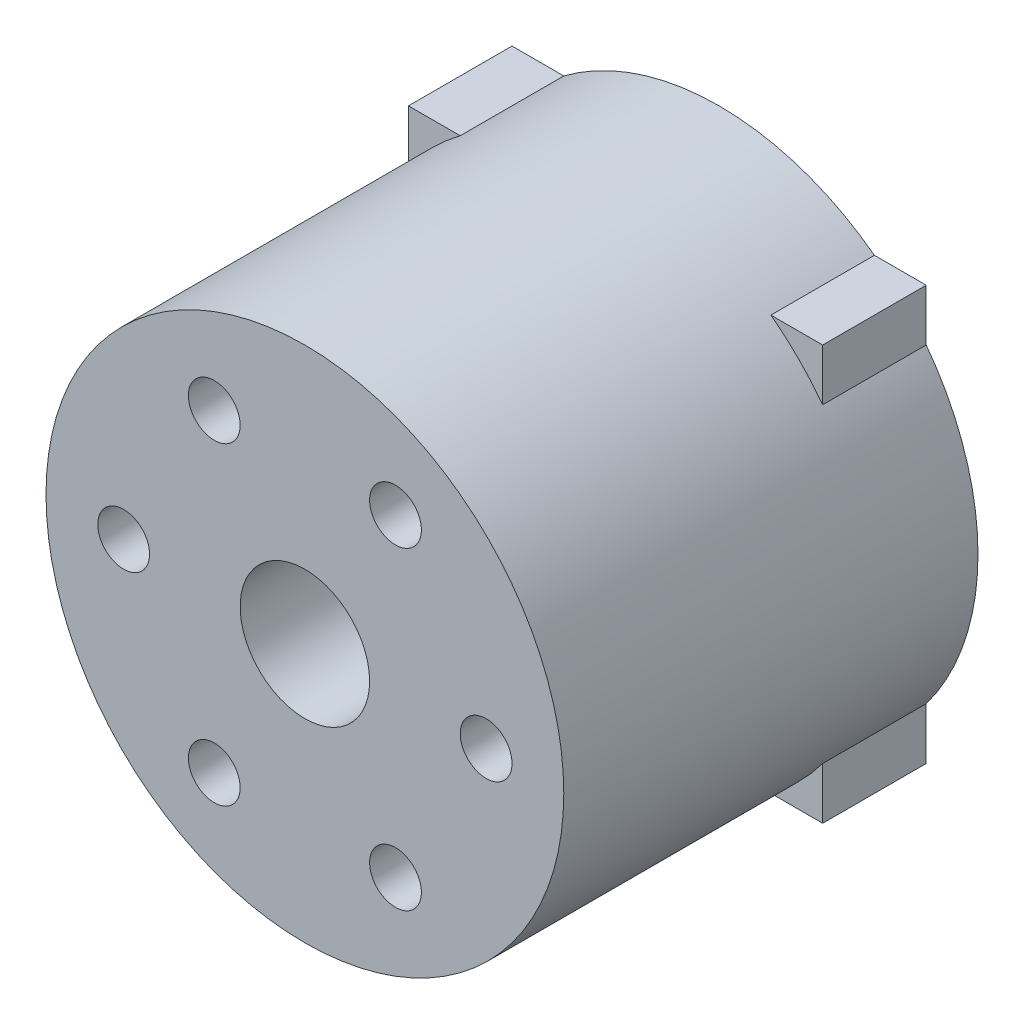
ISO-10303-21;
HEADER;
FILE_DESCRIPTION(('STEP AP214'),'2;1');
FILE_NAME('part.step','',(''),(''),'','','');
FILE_SCHEMA(('AUTOMOTIVE_DESIGN { 1 0 10303 214 1 1 1 1 }'));
ENDSEC;
DATA;
#1=APPLICATION_CONTEXT('core data for automotive mechanical design processes');
#2=APPLICATION_PROTOCOL_DEFINITION('international standard','automotive_design',2000,#1);
#3=PRODUCT_CONTEXT('',#1,'mechanical');
#4=PRODUCT('Part','Part','',(#3));
#5=PRODUCT_RELATED_PRODUCT_CATEGORY('part','',(#4));
#6=PRODUCT_DEFINITION_FORMATION('','',#4);
#7=PRODUCT_DEFINITION_CONTEXT('part definition',#1,'design');
#8=PRODUCT_DEFINITION('design','',#6,#7);
#9=PRODUCT_DEFINITION_SHAPE('','',#8);
#10=(LENGTH_UNIT() NAMED_UNIT(*) SI_UNIT(.MILLI.,.METRE.));
#11=(NAMED_UNIT(*) PLANE_ANGLE_UNIT() SI_UNIT($,.RADIAN.));
#12=(NAMED_UNIT(*) SI_UNIT($,.STERADIAN.) SOLID_ANGLE_UNIT());
#13=UNCERTAINTY_MEASURE_WITH_UNIT(LENGTH_MEASURE(1.E-05),#10,'distance_accuracy_value','');
#14=(GEOMETRIC_REPRESENTATION_CONTEXT(3) GLOBAL_UNCERTAINTY_ASSIGNED_CONTEXT((#13)) GLOBAL_UNIT_ASSIGNED_CONTEXT((#10,
#11,#12)) REPRESENTATION_CONTEXT('',''));
#15=CARTESIAN_POINT('',(0.,0.,0.));
#16=DIRECTION('',(0.,0.,1.));
#17=DIRECTION('',(1.,0.,0.));
#18=AXIS2_PLACEMENT_3D('',#15,#16,#17);
#19=CARTESIAN_POINT('',(0.,0.,20.));
#20=DIRECTION('',(0.,0.,1.));
#21=DIRECTION('',(1.,0.,0.));
#22=AXIS2_PLACEMENT_3D('',#19,#20,#21);
#23=PLANE('',#22);
#24=CARTESIAN_POINT('',(17.5,30.310889132455,20.));
#25=DIRECTION('',(0.,0.,-1.));
#26=DIRECTION('',(0.50000000000019,0.866025403784329,0.));
#27=AXIS2_PLACEMENT_3D('',#24,#25,#26);
#28=CIRCLE('',#27,5.);
#29=CARTESIAN_POINT('',(20.,34.641016151378,20.));
#30=VERTEX_POINT('',#29);
#31=EDGE_CURVE('E10',#30,#30,#28,.T.);
#32=ORIENTED_EDGE('',*,*,#31,.F.);
#33=EDGE_LOOP('',(#32));
#34=FACE_BOUND('',#33,.T.);
#35=ADVANCED_FACE('F16',(#34),#23,.T.);
#36=CARTESIAN_POINT('',(0.,0.,20.));
#37=DIRECTION('',(0.,0.,1.));
#38=DIRECTION('',(1.,0.,0.));
#39=AXIS2_PLACEMENT_3D('',#36,#37,#38);
#40=PLANE('',#39);
#41=CARTESIAN_POINT('',(-17.5,30.310889132455,20.));
#42=DIRECTION('',(0.,0.,-1.));
#43=DIRECTION('',(-0.50000000000019,0.866025403784329,0.));
#44=AXIS2_PLACEMENT_3D('',#41,#42,#43);
#45=CIRCLE('',#44,5.);
#46=CARTESIAN_POINT('',(-20.,34.641016151378,20.));
#47=VERTEX_POINT('',#46);
#48=EDGE_CURVE('E44',#47,#47,#45,.T.);
#49=ORIENTED_EDGE('',*,*,#48,.F.);
#50=EDGE_LOOP('',(#49));
#51=FACE_BOUND('',#50,.T.);
#52=ADVANCED_FACE('F424',(#51),#40,.T.);
#53=CARTESIAN_POINT('',(0.,0.,20.));
#54=DIRECTION('',(0.,0.,1.));
#55=DIRECTION('',(1.,0.,0.));
#56=AXIS2_PLACEMENT_3D('',#53,#54,#55);
#57=PLANE('',#56);
#58=CARTESIAN_POINT('',(-35.,0.,20.));
#59=DIRECTION('',(0.,0.,-1.));
#60=DIRECTION('',(-1.,0.,0.));
#61=AXIS2_PLACEMENT_3D('',#58,#59,#60);
#62=CIRCLE('',#61,5.);
#63=CARTESIAN_POINT('',(-40.,0.,20.));
#64=VERTEX_POINT('',#63);
#65=EDGE_CURVE('E274',#64,#64,#62,.T.);
#66=ORIENTED_EDGE('',*,*,#65,.F.);
#67=EDGE_LOOP('',(#66));
#68=FACE_BOUND('',#67,.T.);
#69=ADVANCED_FACE('F421',(#68),#57,.T.);
#70=CARTESIAN_POINT('',(0.,0.,20.));
#71=DIRECTION('',(0.,0.,1.));
#72=DIRECTION('',(1.,0.,0.));
#73=AXIS2_PLACEMENT_3D('',#70,#71,#72);
#74=PLANE('',#73);
#75=CARTESIAN_POINT('',(35.,0.,20.));
#76=DIRECTION('',(0.,0.,-1.));
#77=DIRECTION('',(1.,0.,0.));
#78=AXIS2_PLACEMENT_3D('',#75,#76,#77);
#79=CIRCLE('',#78,5.);
#80=CARTESIAN_POINT('',(40.,0.,20.));
#81=VERTEX_POINT('',#80);
#82=EDGE_CURVE('E331',#81,#81,#79,.T.);
#83=ORIENTED_EDGE('',*,*,#82,.F.);
#84=EDGE_LOOP('',(#83));
#85=FACE_BOUND('',#84,.T.);
#86=ADVANCED_FACE('F423',(#85),#74,.T.);
#87=CARTESIAN_POINT('',(0.,0.,20.));
#88=DIRECTION('',(0.,0.,1.));
#89=DIRECTION('',(1.,0.,0.));
#90=AXIS2_PLACEMENT_3D('',#87,#88,#89);
#91=PLANE('',#90);
#92=CARTESIAN_POINT('',(17.5,-30.31088913245,20.));
#93=DIRECTION('',(0.,0.,-1.));
#94=DIRECTION('',(0.50000000000019,-0.866025403784329,0.));
#95=AXIS2_PLACEMENT_3D('',#92,#93,#94);
#96=CIRCLE('',#95,5.);
#97=CARTESIAN_POINT('',(20.,-34.64101615137,20.));
#98=VERTEX_POINT('',#97);
#99=EDGE_CURVE('E242',#98,#98,#96,.T.);
#100=ORIENTED_EDGE('',*,*,#99,.F.);
#101=EDGE_LOOP('',(#100));
#102=FACE_BOUND('',#101,.T.);
#103=ADVANCED_FACE('F431',(#102),#91,.T.);
#104=CARTESIAN_POINT('',(0.,0.,20.));
#105=DIRECTION('',(0.,0.,1.));
#106=DIRECTION('',(1.,0.,0.));
#107=AXIS2_PLACEMENT_3D('',#104,#105,#106);
#108=PLANE('',#107);
#109=CARTESIAN_POINT('',(-17.5,-30.31088913245,20.));
#110=DIRECTION('',(0.,0.,-1.));
#111=DIRECTION('',(-0.50000000000019,-0.866025403784329,0.));
#112=AXIS2_PLACEMENT_3D('',#109,#110,#111);
#113=CIRCLE('',#112,5.);
#114=CARTESIAN_POINT('',(-20.,-34.64101615137,20.));
#115=VERTEX_POINT('',#114);
#116=EDGE_CURVE('E243',#115,#115,#113,.T.);
#117=ORIENTED_EDGE('',*,*,#116,.F.);
#118=EDGE_LOOP('',(#117));
#119=FACE_BOUND('',#118,.T.);
#120=ADVANCED_FACE('F631',(#119),#108,.T.);
#121=CARTESIAN_POINT('',(17.5,30.310889132455,40.));
#122=DIRECTION('',(0.,0.,-1.));
#123=DIRECTION('',(0.50000000000019,0.866025403784329,0.));
#124=AXIS2_PLACEMENT_3D('',#121,#122,#123);
#125=CYLINDRICAL_SURFACE('',#124,5.);
#126=CARTESIAN_POINT('',(17.5,30.310889132455,80.));
#127=DIRECTION('',(0.,0.,-1.));
#128=DIRECTION('',(0.50000000000019,0.866025403784329,0.));
#129=AXIS2_PLACEMENT_3D('',#126,#127,#128);
#130=CIRCLE('',#129,5.);
#131=CARTESIAN_POINT('',(20.,34.641016151378,80.));
#132=VERTEX_POINT('',#131);
#133=EDGE_CURVE('E313',#132,#132,#130,.T.);
#134=ORIENTED_EDGE('',*,*,#133,.F.);
#135=DIRECTION('',(0.,0.,-1.));
#136=VECTOR('',#135,1.);
#137=CARTESIAN_POINT('',(20.,34.641016151378,80.));
#138=LINE('',#137,#136);
#139=EDGE_CURVE('E19',#132,#30,#138,.T.);
#140=ORIENTED_EDGE('',*,*,#139,.T.);
#141=ORIENTED_EDGE('',*,*,#31,.T.);
#142=ORIENTED_EDGE('',*,*,#139,.F.);
#143=EDGE_LOOP('',(#134,#140,#141,#142));
#144=FACE_BOUND('',#143,.T.);
#145=ADVANCED_FACE('F440',(#144),#125,.F.);
#146=CARTESIAN_POINT('',(-17.5,30.310889132455,40.));
#147=DIRECTION('',(0.,0.,-1.));
#148=DIRECTION('',(-0.50000000000019,0.866025403784329,0.));
#149=AXIS2_PLACEMENT_3D('',#146,#147,#148);
#150=CYLINDRICAL_SURFACE('',#149,5.);
#151=CARTESIAN_POINT('',(-17.5,30.310889132455,80.));
#152=DIRECTION('',(0.,0.,-1.));
#153=DIRECTION('',(-0.50000000000019,0.866025403784329,0.));
#154=AXIS2_PLACEMENT_3D('',#151,#152,#153);
#155=CIRCLE('',#154,5.);
#156=CARTESIAN_POINT('',(-20.,34.641016151378,80.));
#157=VERTEX_POINT('',#156);
#158=EDGE_CURVE('E397',#157,#157,#155,.T.);
#159=ORIENTED_EDGE('',*,*,#158,.F.);
#160=DIRECTION('',(0.,0.,-1.));
#161=VECTOR('',#160,1.);
#162=CARTESIAN_POINT('',(-20.,34.641016151378,80.));
#163=LINE('',#162,#161);
#164=EDGE_CURVE('E271',#157,#47,#163,.T.);
#165=ORIENTED_EDGE('',*,*,#164,.T.);
#166=ORIENTED_EDGE('',*,*,#48,.T.);
#167=ORIENTED_EDGE('',*,*,#164,.F.);
#168=EDGE_LOOP('',(#159,#165,#166,#167));
#169=FACE_BOUND('',#168,.T.);
#170=ADVANCED_FACE('F616',(#169),#150,.F.);
#171=CARTESIAN_POINT('',(-35.,0.,40.));
#172=DIRECTION('',(0.,0.,-1.));
#173=DIRECTION('',(-1.,0.,0.));
#174=AXIS2_PLACEMENT_3D('',#171,#172,#173);
#175=CYLINDRICAL_SURFACE('',#174,5.);
#176=CARTESIAN_POINT('',(-35.,0.,80.));
#177=DIRECTION('',(0.,0.,-1.));
#178=DIRECTION('',(-1.,0.,0.));
#179=AXIS2_PLACEMENT_3D('',#176,#177,#178);
#180=CIRCLE('',#179,5.);
#181=CARTESIAN_POINT('',(-40.,0.,80.));
#182=VERTEX_POINT('',#181);
#183=EDGE_CURVE('E374',#182,#182,#180,.T.);
#184=ORIENTED_EDGE('',*,*,#183,.F.);
#185=DIRECTION('',(0.,0.,-1.));
#186=VECTOR('',#185,1.);
#187=CARTESIAN_POINT('',(-40.,0.,80.));
#188=LINE('',#187,#186);
#189=EDGE_CURVE('E328',#182,#64,#188,.T.);
#190=ORIENTED_EDGE('',*,*,#189,.T.);
#191=ORIENTED_EDGE('',*,*,#65,.T.);
#192=ORIENTED_EDGE('',*,*,#189,.F.);
#193=EDGE_LOOP('',(#184,#190,#191,#192));
#194=FACE_BOUND('',#193,.T.);
#195=ADVANCED_FACE('F419',(#194),#175,.F.);
#196=CARTESIAN_POINT('',(35.,0.,40.));
#197=DIRECTION('',(0.,0.,-1.));
#198=DIRECTION('',(1.,0.,0.));
#199=AXIS2_PLACEMENT_3D('',#196,#197,#198);
#200=CYLINDRICAL_SURFACE('',#199,5.);
#201=CARTESIAN_POINT('',(35.,0.,80.));
#202=DIRECTION('',(0.,0.,-1.));
#203=DIRECTION('',(1.,0.,0.));
#204=AXIS2_PLACEMENT_3D('',#201,#202,#203);
#205=CIRCLE('',#204,5.);
#206=CARTESIAN_POINT('',(40.,0.,80.));
#207=VERTEX_POINT('',#206);
#208=EDGE_CURVE('E370',#207,#207,#205,.T.);
#209=ORIENTED_EDGE('',*,*,#208,.F.);
#210=DIRECTION('',(0.,0.,-1.));
#211=VECTOR('',#210,1.);
#212=CARTESIAN_POINT('',(40.,0.,80.));
#213=LINE('',#212,#211);
#214=EDGE_CURVE('E408',#207,#81,#213,.T.);
#215=ORIENTED_EDGE('',*,*,#214,.T.);
#216=ORIENTED_EDGE('',*,*,#82,.T.);
#217=ORIENTED_EDGE('',*,*,#214,.F.);
#218=EDGE_LOOP('',(#209,#215,#216,#217));
#219=FACE_BOUND('',#218,.T.);
#220=ADVANCED_FACE('F451',(#219),#200,.F.);
#221=CARTESIAN_POINT('',(17.5,-30.31088913245,40.));
#222=DIRECTION('',(0.,0.,-1.));
#223=DIRECTION('',(0.50000000000019,-0.866025403784329,0.));
#224=AXIS2_PLACEMENT_3D('',#221,#222,#223);
#225=CYLINDRICAL_SURFACE('',#224,5.);
#226=CARTESIAN_POINT('',(17.5,-30.31088913245,80.));
#227=DIRECTION('',(0.,0.,-1.));
#228=DIRECTION('',(0.50000000000019,-0.866025403784329,0.));
#229=AXIS2_PLACEMENT_3D('',#226,#227,#228);
#230=CIRCLE('',#229,5.);
#231=CARTESIAN_POINT('',(20.,-34.64101615137,80.));
#232=VERTEX_POINT('',#231);
#233=EDGE_CURVE('E375',#232,#232,#230,.T.);
#234=ORIENTED_EDGE('',*,*,#233,.F.);
#235=DIRECTION('',(0.,0.,-1.));
#236=VECTOR('',#235,1.);
#237=CARTESIAN_POINT('',(20.,-34.64101615137,80.));
#238=LINE('',#237,#236);
#239=EDGE_CURVE('E238',#232,#98,#238,.T.);
#240=ORIENTED_EDGE('',*,*,#239,.T.);
#241=ORIENTED_EDGE('',*,*,#99,.T.);
#242=ORIENTED_EDGE('',*,*,#239,.F.);
#243=EDGE_LOOP('',(#234,#240,#241,#242));
#244=FACE_BOUND('',#243,.T.);
#245=ADVANCED_FACE('F445',(#244),#225,.F.);
#246=CARTESIAN_POINT('',(-17.5,-30.31088913245,40.));
#247=DIRECTION('',(0.,0.,-1.));
#248=DIRECTION('',(-0.50000000000019,-0.866025403784329,0.));
#249=AXIS2_PLACEMENT_3D('',#246,#247,#248);
#250=CYLINDRICAL_SURFACE('',#249,5.);
#251=CARTESIAN_POINT('',(-17.5,-30.31088913245,80.));
#252=DIRECTION('',(0.,0.,-1.));
#253=DIRECTION('',(-0.50000000000019,-0.866025403784329,0.));
#254=AXIS2_PLACEMENT_3D('',#251,#252,#253);
#255=CIRCLE('',#254,5.);
#256=CARTESIAN_POINT('',(-20.,-34.64101615137,80.));
#257=VERTEX_POINT('',#256);
#258=EDGE_CURVE('E381',#257,#257,#255,.T.);
#259=ORIENTED_EDGE('',*,*,#258,.F.);
#260=DIRECTION('',(0.,0.,-1.));
#261=VECTOR('',#260,1.);
#262=CARTESIAN_POINT('',(-20.,-34.64101615137,80.));
#263=LINE('',#262,#261);
#264=EDGE_CURVE('E309',#257,#115,#263,.T.);
#265=ORIENTED_EDGE('',*,*,#264,.T.);
#266=ORIENTED_EDGE('',*,*,#116,.T.);
#267=ORIENTED_EDGE('',*,*,#264,.F.);
#268=EDGE_LOOP('',(#259,#265,#266,#267));
#269=FACE_BOUND('',#268,.T.);
#270=ADVANCED_FACE('F450',(#269),#250,.F.);
#271=CARTESIAN_POINT('',(0.,0.,80.));
#272=DIRECTION('',(0.,0.,1.));
#273=DIRECTION('',(1.,0.,0.));
#274=AXIS2_PLACEMENT_3D('',#271,#272,#273);
#275=PLANE('',#274);
#276=ORIENTED_EDGE('',*,*,#133,.T.);
#277=EDGE_LOOP('',(#276));
#278=FACE_BOUND('',#277,.T.);
#279=ORIENTED_EDGE('',*,*,#158,.T.);
#280=EDGE_LOOP('',(#279));
#281=FACE_BOUND('',#280,.T.);
#282=ORIENTED_EDGE('',*,*,#183,.T.);
#283=EDGE_LOOP('',(#282));
#284=FACE_BOUND('',#283,.T.);
#285=ORIENTED_EDGE('',*,*,#208,.T.);
#286=EDGE_LOOP('',(#285));
#287=FACE_BOUND('',#286,.T.);
#288=CARTESIAN_POINT('',(0.,0.,80.));
#289=DIRECTION('',(0.,0.,-1.));
#290=DIRECTION('',(1.,0.,0.));
#291=AXIS2_PLACEMENT_3D('',#288,#289,#290);
#292=CIRCLE('',#291,12.5);
#293=CARTESIAN_POINT('',(12.5,0.,80.));
#294=VERTEX_POINT('',#293);
#295=EDGE_CURVE('E265',#294,#294,#292,.T.);
#296=ORIENTED_EDGE('',*,*,#295,.T.);
#297=EDGE_LOOP('',(#296));
#298=FACE_BOUND('',#297,.T.);
#299=ORIENTED_EDGE('',*,*,#233,.T.);
#300=EDGE_LOOP('',(#299));
#301=FACE_BOUND('',#300,.T.);
#302=ORIENTED_EDGE('',*,*,#258,.T.);
#303=EDGE_LOOP('',(#302));
#304=FACE_BOUND('',#303,.T.);
#305=CARTESIAN_POINT('',(0.,0.,80.));
#306=DIRECTION('',(0.,0.,1.));
#307=DIRECTION('',(1.,0.,0.));
#308=AXIS2_PLACEMENT_3D('',#305,#306,#307);
#309=CIRCLE('',#308,50.);
#310=CARTESIAN_POINT('',(50.,0.,80.));
#311=VERTEX_POINT('',#310);
#312=EDGE_CURVE('E232',#311,#311,#309,.T.);
#313=ORIENTED_EDGE('',*,*,#312,.T.);
#314=EDGE_LOOP('',(#313));
#315=FACE_BOUND('',#314,.T.);
#316=ADVANCED_FACE('F520',(#278,#281,#284,#287,#298,#301,#304,#315),#275,.T.);
#317=CARTESIAN_POINT('',(0.,0.,0.));
#318=DIRECTION('',(0.,0.,-1.));
#319=DIRECTION('',(1.,0.,0.));
#320=AXIS2_PLACEMENT_3D('',#317,#318,#319);
#321=CYLINDRICAL_SURFACE('',#320,12.5);
#322=CARTESIAN_POINT('',(0.,0.,0.));
#323=DIRECTION('',(0.,0.,1.));
#324=DIRECTION('',(1.,0.,0.));
#325=AXIS2_PLACEMENT_3D('',#322,#323,#324);
#326=CIRCLE('',#325,12.5);
#327=CARTESIAN_POINT('',(12.5,0.,0.));
#328=VERTEX_POINT('',#327);
#329=EDGE_CURVE('E322',#328,#328,#326,.T.);
#330=ORIENTED_EDGE('',*,*,#329,.F.);
#331=DIRECTION('',(0.,0.,1.));
#332=VECTOR('',#331,1.);
#333=CARTESIAN_POINT('',(12.5,0.,0.));
#334=LINE('',#333,#332);
#335=EDGE_CURVE('E261',#328,#294,#334,.T.);
#336=ORIENTED_EDGE('',*,*,#335,.T.);
#337=ORIENTED_EDGE('',*,*,#295,.F.);
#338=ORIENTED_EDGE('',*,*,#335,.F.);
#339=EDGE_LOOP('',(#330,#336,#337,#338));
#340=FACE_BOUND('',#339,.T.);
#341=ADVANCED_FACE('F514',(#340),#321,.F.);
#342=CARTESIAN_POINT('',(40.,-40.,0.));
#343=DIRECTION('',(-1.,0.,0.));
#344=DIRECTION('',(0.,0.,1.));
#345=AXIS2_PLACEMENT_3D('',#342,#343,#344);
#346=PLANE('',#345);
#347=DIRECTION('',(0.,0.,1.));
#348=VECTOR('',#347,1.);
#349=CARTESIAN_POINT('',(40.,40.,0.));
#350=LINE('',#349,#348);
#351=CARTESIAN_POINT('',(40.,40.,0.));
#352=VERTEX_POINT('',#351);
#353=CARTESIAN_POINT('',(40.,40.,20.));
#354=VERTEX_POINT('',#353);
#355=EDGE_CURVE('E275',#352,#354,#350,.T.);
#356=ORIENTED_EDGE('',*,*,#355,.T.);
#357=DIRECTION('',(0.,1.,0.));
#358=VECTOR('',#357,1.);
#359=CARTESIAN_POINT('',(40.,-40.,20.));
#360=LINE('',#359,#358);
#361=CARTESIAN_POINT('',(40.,30.,20.));
#362=VERTEX_POINT('',#361);
#363=EDGE_CURVE('E266',#362,#354,#360,.T.);
#364=ORIENTED_EDGE('',*,*,#363,.F.);
#365=DIRECTION('',(0.,0.,1.));
#366=VECTOR('',#365,1.);
#367=CARTESIAN_POINT('',(40.,30.,0.));
#368=LINE('',#367,#366);
#369=CARTESIAN_POINT('',(40.,29.999999999999,0.));
#370=VERTEX_POINT('',#369);
#371=EDGE_CURVE('E246',#370,#362,#368,.T.);
#372=ORIENTED_EDGE('',*,*,#371,.F.);
#373=DIRECTION('',(0.,1.,0.));
#374=VECTOR('',#373,1.);
#375=CARTESIAN_POINT('',(40.,-40.,0.));
#376=LINE('',#375,#374);
#377=EDGE_CURVE('E318',#370,#352,#376,.T.);
#378=ORIENTED_EDGE('',*,*,#377,.T.);
#379=EDGE_LOOP('',(#356,#364,#372,#378));
#380=FACE_BOUND('',#379,.T.);
#381=ADVANCED_FACE('F519',(#380),#346,.F.);
#382=CARTESIAN_POINT('',(0.,0.,20.));
#383=DIRECTION('',(0.,0.,1.));
#384=DIRECTION('',(1.,0.,0.));
#385=AXIS2_PLACEMENT_3D('',#382,#383,#384);
#386=PLANE('',#385);
#387=CARTESIAN_POINT('',(0.,0.,20.));
#388=DIRECTION('',(0.,0.,1.));
#389=DIRECTION('',(1.,0.,0.));
#390=AXIS2_PLACEMENT_3D('',#387,#388,#389);
#391=CIRCLE('',#390,50.);
#392=CARTESIAN_POINT('',(30.,40.,20.));
#393=VERTEX_POINT('',#392);
#394=EDGE_CURVE('E256',#362,#393,#391,.T.);
#395=ORIENTED_EDGE('',*,*,#394,.F.);
#396=ORIENTED_EDGE('',*,*,#363,.T.);
#397=DIRECTION('',(-1.,0.,0.));
#398=VECTOR('',#397,1.);
#399=CARTESIAN_POINT('',(40.,40.,20.));
#400=LINE('',#399,#398);
#401=EDGE_CURVE('E279',#354,#393,#400,.T.);
#402=ORIENTED_EDGE('',*,*,#401,.T.);
#403=EDGE_LOOP('',(#395,#396,#402));
#404=FACE_BOUND('',#403,.T.);
#405=ADVANCED_FACE('F571',(#404),#386,.T.);
#406=CARTESIAN_POINT('',(40.,40.,0.));
#407=DIRECTION('',(0.,-1.,0.));
#408=DIRECTION('',(0.,0.,-1.));
#409=AXIS2_PLACEMENT_3D('',#406,#407,#408);
#410=PLANE('',#409);
#411=DIRECTION('',(0.,0.,1.));
#412=VECTOR('',#411,1.);
#413=CARTESIAN_POINT('',(30.,40.,0.));
#414=LINE('',#413,#412);
#415=CARTESIAN_POINT('',(30.000000000002,39.999999999999,0.));
#416=VERTEX_POINT('',#415);
#417=EDGE_CURVE('E260',#416,#393,#414,.T.);
#418=ORIENTED_EDGE('',*,*,#417,.T.);
#419=ORIENTED_EDGE('',*,*,#401,.F.);
#420=ORIENTED_EDGE('',*,*,#355,.F.);
#421=DIRECTION('',(-1.,0.,0.));
#422=VECTOR('',#421,1.);
#423=CARTESIAN_POINT('',(40.,40.,0.));
#424=LINE('',#423,#422);
#425=EDGE_CURVE('E323',#352,#416,#424,.T.);
#426=ORIENTED_EDGE('',*,*,#425,.T.);
#427=EDGE_LOOP('',(#418,#419,#420,#426));
#428=FACE_BOUND('',#427,.T.);
#429=ADVANCED_FACE('F562',(#428),#410,.F.);
#430=CARTESIAN_POINT('',(40.,40.,0.));
#431=DIRECTION('',(0.,-1.,0.));
#432=DIRECTION('',(0.,0.,-1.));
#433=AXIS2_PLACEMENT_3D('',#430,#431,#432);
#434=PLANE('',#433);
#435=DIRECTION('',(0.,0.,1.));
#436=VECTOR('',#435,1.);
#437=CARTESIAN_POINT('',(-40.,40.,0.));
#438=LINE('',#437,#436);
#439=CARTESIAN_POINT('',(-40.,40.,0.));
#440=VERTEX_POINT('',#439);
#441=CARTESIAN_POINT('',(-40.,40.,20.));
#442=VERTEX_POINT('',#441);
#443=EDGE_CURVE('E283',#440,#442,#438,.T.);
#444=ORIENTED_EDGE('',*,*,#443,.T.);
#445=DIRECTION('',(-1.,0.,0.));
#446=VECTOR('',#445,1.);
#447=CARTESIAN_POINT('',(40.,40.,20.));
#448=LINE('',#447,#446);
#449=CARTESIAN_POINT('',(-30.,40.,20.));
#450=VERTEX_POINT('',#449);
#451=EDGE_CURVE('E287',#450,#442,#448,.T.);
#452=ORIENTED_EDGE('',*,*,#451,.F.);
#453=DIRECTION('',(0.,0.,1.));
#454=VECTOR('',#453,1.);
#455=CARTESIAN_POINT('',(-30.,40.,0.));
#456=LINE('',#455,#454);
#457=CARTESIAN_POINT('',(-30.,40.,0.));
#458=VERTEX_POINT('',#457);
#459=EDGE_CURVE('E252',#458,#450,#456,.T.);
#460=ORIENTED_EDGE('',*,*,#459,.F.);
#461=DIRECTION('',(-1.,0.,0.));
#462=VECTOR('',#461,1.);
#463=CARTESIAN_POINT('',(40.,40.,0.));
#464=LINE('',#463,#462);
#465=EDGE_CURVE('E348',#458,#440,#464,.T.);
#466=ORIENTED_EDGE('',*,*,#465,.T.);
#467=EDGE_LOOP('',(#444,#452,#460,#466));
#468=FACE_BOUND('',#467,.T.);
#469=ADVANCED_FACE('F481',(#468),#434,.F.);
#470=CARTESIAN_POINT('',(0.,0.,20.));
#471=DIRECTION('',(0.,0.,1.));
#472=DIRECTION('',(1.,0.,0.));
#473=AXIS2_PLACEMENT_3D('',#470,#471,#472);
#474=PLANE('',#473);
#475=DIRECTION('',(0.,-1.,0.));
#476=VECTOR('',#475,1.);
#477=CARTESIAN_POINT('',(-40.,40.,20.));
#478=LINE('',#477,#476);
#479=CARTESIAN_POINT('',(-40.,30.,20.));
#480=VERTEX_POINT('',#479);
#481=EDGE_CURVE('E288',#442,#480,#478,.T.);
#482=ORIENTED_EDGE('',*,*,#481,.T.);
#483=CARTESIAN_POINT('',(0.,0.,20.));
#484=DIRECTION('',(0.,0.,1.));
#485=DIRECTION('',(1.,0.,0.));
#486=AXIS2_PLACEMENT_3D('',#483,#484,#485);
#487=CIRCLE('',#486,50.);
#488=EDGE_CURVE('E247',#450,#480,#487,.T.);
#489=ORIENTED_EDGE('',*,*,#488,.F.);
#490=ORIENTED_EDGE('',*,*,#451,.T.);
#491=EDGE_LOOP('',(#482,#489,#490));
#492=FACE_BOUND('',#491,.T.);
#493=ADVANCED_FACE('F475',(#492),#474,.T.);
#494=CARTESIAN_POINT('',(-40.,40.,0.));
#495=DIRECTION('',(1.,0.,0.));
#496=DIRECTION('',(0.,1.,0.));
#497=AXIS2_PLACEMENT_3D('',#494,#495,#496);
#498=PLANE('',#497);
#499=DIRECTION('',(0.,0.,1.));
#500=VECTOR('',#499,1.);
#501=CARTESIAN_POINT('',(-40.,30.,0.));
#502=LINE('',#501,#500);
#503=CARTESIAN_POINT('',(-39.99999999999,30.000000000002,0.));
#504=VERTEX_POINT('',#503);
#505=EDGE_CURVE('E251',#504,#480,#502,.T.);
#506=ORIENTED_EDGE('',*,*,#505,.T.);
#507=ORIENTED_EDGE('',*,*,#481,.F.);
#508=ORIENTED_EDGE('',*,*,#443,.F.);
#509=DIRECTION('',(0.,-1.,0.));
#510=VECTOR('',#509,1.);
#511=CARTESIAN_POINT('',(-40.,40.,0.));
#512=LINE('',#511,#510);
#513=EDGE_CURVE('E346',#440,#504,#512,.T.);
#514=ORIENTED_EDGE('',*,*,#513,.T.);
#515=EDGE_LOOP('',(#506,#507,#508,#514));
#516=FACE_BOUND('',#515,.T.);
#517=ADVANCED_FACE('F480',(#516),#498,.F.);
#518=CARTESIAN_POINT('',(-40.,40.,0.));
#519=DIRECTION('',(1.,0.,0.));
#520=DIRECTION('',(0.,1.,0.));
#521=AXIS2_PLACEMENT_3D('',#518,#519,#520);
#522=PLANE('',#521);
#523=DIRECTION('',(0.,0.,1.));
#524=VECTOR('',#523,1.);
#525=CARTESIAN_POINT('',(-40.,-40.,0.));
#526=LINE('',#525,#524);
#527=CARTESIAN_POINT('',(-40.,-40.,0.));
#528=VERTEX_POINT('',#527);
#529=CARTESIAN_POINT('',(-40.,-40.,20.));
#530=VERTEX_POINT('',#529);
#531=EDGE_CURVE('E369',#528,#530,#526,.T.);
#532=ORIENTED_EDGE('',*,*,#531,.T.);
#533=DIRECTION('',(0.,-1.,0.));
#534=VECTOR('',#533,1.);
#535=CARTESIAN_POINT('',(-40.,40.,20.));
#536=LINE('',#535,#534);
#537=CARTESIAN_POINT('',(-40.,-30.,20.));
#538=VERTEX_POINT('',#537);
#539=EDGE_CURVE('E235',#538,#530,#536,.T.);
#540=ORIENTED_EDGE('',*,*,#539,.F.);
#541=DIRECTION('',(0.,0.,1.));
#542=VECTOR('',#541,1.);
#543=CARTESIAN_POINT('',(-40.,-30.,0.));
#544=LINE('',#543,#542);
#545=CARTESIAN_POINT('',(-39.99999999999,-30.,0.));
#546=VERTEX_POINT('',#545);
#547=EDGE_CURVE('E296',#546,#538,#544,.T.);
#548=ORIENTED_EDGE('',*,*,#547,.F.);
#549=DIRECTION('',(0.,-1.,0.));
#550=VECTOR('',#549,1.);
#551=CARTESIAN_POINT('',(-40.,40.,0.));
#552=LINE('',#551,#550);
#553=EDGE_CURVE('E342',#546,#528,#552,.T.);
#554=ORIENTED_EDGE('',*,*,#553,.T.);
#555=EDGE_LOOP('',(#532,#540,#548,#554));
#556=FACE_BOUND('',#555,.T.);
#557=ADVANCED_FACE('F539',(#556),#522,.F.);
#558=CARTESIAN_POINT('',(0.,0.,20.));
#559=DIRECTION('',(0.,0.,1.));
#560=DIRECTION('',(1.,0.,0.));
#561=AXIS2_PLACEMENT_3D('',#558,#559,#560);
#562=PLANE('',#561);
#563=ORIENTED_EDGE('',*,*,#539,.T.);
#564=DIRECTION('',(1.,0.,0.));
#565=VECTOR('',#564,1.);
#566=CARTESIAN_POINT('',(-40.,-40.,20.));
#567=LINE('',#566,#565);
#568=CARTESIAN_POINT('',(-30.,-40.,20.));
#569=VERTEX_POINT('',#568);
#570=EDGE_CURVE('E366',#530,#569,#567,.T.);
#571=ORIENTED_EDGE('',*,*,#570,.T.);
#572=CARTESIAN_POINT('',(0.,0.,20.));
#573=DIRECTION('',(0.,0.,1.));
#574=DIRECTION('',(1.,0.,0.));
#575=AXIS2_PLACEMENT_3D('',#572,#573,#574);
#576=CIRCLE('',#575,50.);
#577=EDGE_CURVE('E300',#538,#569,#576,.T.);
#578=ORIENTED_EDGE('',*,*,#577,.F.);
#579=EDGE_LOOP('',(#563,#571,#578));
#580=FACE_BOUND('',#579,.T.);
#581=ADVANCED_FACE('F530',(#580),#562,.T.);
#582=CARTESIAN_POINT('',(-40.,-40.,0.));
#583=DIRECTION('',(0.,1.,0.));
#584=DIRECTION('',(1.,0.,0.));
#585=AXIS2_PLACEMENT_3D('',#582,#583,#584);
#586=PLANE('',#585);
#587=DIRECTION('',(0.,0.,1.));
#588=VECTOR('',#587,1.);
#589=CARTESIAN_POINT('',(-30.,-40.,0.));
#590=LINE('',#589,#588);
#591=CARTESIAN_POINT('',(-30.,-40.,0.));
#592=VERTEX_POINT('',#591);
#593=EDGE_CURVE('E304',#592,#569,#590,.T.);
#594=ORIENTED_EDGE('',*,*,#593,.T.);
#595=ORIENTED_EDGE('',*,*,#570,.F.);
#596=ORIENTED_EDGE('',*,*,#531,.F.);
#597=DIRECTION('',(1.,0.,0.));
#598=VECTOR('',#597,1.);
#599=CARTESIAN_POINT('',(-40.,-40.,0.));
#600=LINE('',#599,#598);
#601=EDGE_CURVE('E339',#528,#592,#600,.T.);
#602=ORIENTED_EDGE('',*,*,#601,.T.);
#603=EDGE_LOOP('',(#594,#595,#596,#602));
#604=FACE_BOUND('',#603,.T.);
#605=ADVANCED_FACE('F508',(#604),#586,.F.);
#606=CARTESIAN_POINT('',(-40.,-40.,0.));
#607=DIRECTION('',(0.,1.,0.));
#608=DIRECTION('',(1.,0.,0.));
#609=AXIS2_PLACEMENT_3D('',#606,#607,#608);
#610=PLANE('',#609);
#611=DIRECTION('',(0.,0.,1.));
#612=VECTOR('',#611,1.);
#613=CARTESIAN_POINT('',(40.,-40.,0.));
#614=LINE('',#613,#612);
#615=CARTESIAN_POINT('',(40.,-40.,0.));
#616=VERTEX_POINT('',#615);
#617=CARTESIAN_POINT('',(40.,-40.,20.));
#618=VERTEX_POINT('',#617);
#619=EDGE_CURVE('E205',#616,#618,#614,.T.);
#620=ORIENTED_EDGE('',*,*,#619,.T.);
#621=DIRECTION('',(1.,0.,0.));
#622=VECTOR('',#621,1.);
#623=CARTESIAN_POINT('',(-40.,-40.,20.));
#624=LINE('',#623,#622);
#625=CARTESIAN_POINT('',(30.,-40.,20.));
#626=VERTEX_POINT('',#625);
#627=EDGE_CURVE('E363',#626,#618,#624,.T.);
#628=ORIENTED_EDGE('',*,*,#627,.F.);
#629=DIRECTION('',(0.,0.,1.));
#630=VECTOR('',#629,1.);
#631=CARTESIAN_POINT('',(30.,-40.,0.));
#632=LINE('',#631,#630);
#633=CARTESIAN_POINT('',(30.000000000002,-39.99999999999,0.));
#634=VERTEX_POINT('',#633);
#635=EDGE_CURVE('E317',#634,#626,#632,.T.);
#636=ORIENTED_EDGE('',*,*,#635,.F.);
#637=DIRECTION('',(1.,0.,0.));
#638=VECTOR('',#637,1.);
#639=CARTESIAN_POINT('',(-40.,-40.,0.));
#640=LINE('',#639,#638);
#641=EDGE_CURVE('E210',#634,#616,#640,.T.);
#642=ORIENTED_EDGE('',*,*,#641,.T.);
#643=EDGE_LOOP('',(#620,#628,#636,#642));
#644=FACE_BOUND('',#643,.T.);
#645=ADVANCED_FACE('F499',(#644),#610,.F.);
#646=CARTESIAN_POINT('',(0.,0.,20.));
#647=DIRECTION('',(0.,0.,1.));
#648=DIRECTION('',(1.,0.,0.));
#649=AXIS2_PLACEMENT_3D('',#646,#647,#648);
#650=PLANE('',#649);
#651=CARTESIAN_POINT('',(0.,0.,20.));
#652=DIRECTION('',(0.,0.,1.));
#653=DIRECTION('',(1.,0.,0.));
#654=AXIS2_PLACEMENT_3D('',#651,#652,#653);
#655=CIRCLE('',#654,50.);
#656=CARTESIAN_POINT('',(40.,-30.,20.));
#657=VERTEX_POINT('',#656);
#658=EDGE_CURVE('E219',#626,#657,#655,.T.);
#659=ORIENTED_EDGE('',*,*,#658,.F.);
#660=ORIENTED_EDGE('',*,*,#627,.T.);
#661=DIRECTION('',(0.,1.,0.));
#662=VECTOR('',#661,1.);
#663=CARTESIAN_POINT('',(40.,-40.,20.));
#664=LINE('',#663,#662);
#665=EDGE_CURVE('E358',#618,#657,#664,.T.);
#666=ORIENTED_EDGE('',*,*,#665,.T.);
#667=EDGE_LOOP('',(#659,#660,#666));
#668=FACE_BOUND('',#667,.T.);
#669=ADVANCED_FACE('F491',(#668),#650,.T.);
#670=CARTESIAN_POINT('',(40.,-40.,0.));
#671=DIRECTION('',(-1.,0.,0.));
#672=DIRECTION('',(0.,0.,1.));
#673=AXIS2_PLACEMENT_3D('',#670,#671,#672);
#674=PLANE('',#673);
#675=DIRECTION('',(0.,0.,1.));
#676=VECTOR('',#675,1.);
#677=CARTESIAN_POINT('',(40.,-30.,0.));
#678=LINE('',#677,#676);
#679=CARTESIAN_POINT('',(40.,-29.99999999999,0.));
#680=VERTEX_POINT('',#679);
#681=EDGE_CURVE('E202',#680,#657,#678,.T.);
#682=ORIENTED_EDGE('',*,*,#681,.T.);
#683=ORIENTED_EDGE('',*,*,#665,.F.);
#684=ORIENTED_EDGE('',*,*,#619,.F.);
#685=DIRECTION('',(0.,1.,0.));
#686=VECTOR('',#685,1.);
#687=CARTESIAN_POINT('',(40.,-40.,0.));
#688=LINE('',#687,#686);
#689=EDGE_CURVE('E198',#616,#680,#688,.T.);
#690=ORIENTED_EDGE('',*,*,#689,.T.);
#691=EDGE_LOOP('',(#682,#683,#684,#690));
#692=FACE_BOUND('',#691,.T.);
#693=ADVANCED_FACE('F200',(#692),#674,.F.);
#694=CARTESIAN_POINT('',(0.,0.,0.));
#695=DIRECTION('',(0.,0.,1.));
#696=DIRECTION('',(1.,0.,0.));
#697=AXIS2_PLACEMENT_3D('',#694,#695,#696);
#698=PLANE('',#697);
#699=ORIENTED_EDGE('',*,*,#329,.T.);
#700=EDGE_LOOP('',(#699));
#701=FACE_BOUND('',#700,.T.);
#702=CARTESIAN_POINT('',(0.,0.,0.));
#703=DIRECTION('',(0.,0.,1.));
#704=DIRECTION('',(1.,0.,0.));
#705=AXIS2_PLACEMENT_3D('',#702,#703,#704);
#706=CIRCLE('',#705,50.);
#707=CARTESIAN_POINT('',(50.,0.,0.));
#708=VERTEX_POINT('',#707);
#709=EDGE_CURVE('E224',#708,#370,#706,.T.);
#710=ORIENTED_EDGE('',*,*,#709,.F.);
#711=CARTESIAN_POINT('',(0.,0.,0.));
#712=DIRECTION('',(0.,0.,1.));
#713=DIRECTION('',(1.,0.,0.));
#714=AXIS2_PLACEMENT_3D('',#711,#712,#713);
#715=CIRCLE('',#714,50.);
#716=EDGE_CURVE('E216',#680,#708,#715,.T.);
#717=ORIENTED_EDGE('',*,*,#716,.F.);
#718=ORIENTED_EDGE('',*,*,#689,.F.);
#719=ORIENTED_EDGE('',*,*,#641,.F.);
#720=CARTESIAN_POINT('',(0.,0.,0.));
#721=DIRECTION('',(0.,0.,1.));
#722=DIRECTION('',(1.,0.,0.));
#723=AXIS2_PLACEMENT_3D('',#720,#721,#722);
#724=CIRCLE('',#723,50.);
#725=EDGE_CURVE('E308',#592,#634,#724,.T.);
#726=ORIENTED_EDGE('',*,*,#725,.F.);
#727=ORIENTED_EDGE('',*,*,#601,.F.);
#728=ORIENTED_EDGE('',*,*,#553,.F.);
#729=CARTESIAN_POINT('',(0.,0.,0.));
#730=DIRECTION('',(0.,0.,1.));
#731=DIRECTION('',(1.,0.,0.));
#732=AXIS2_PLACEMENT_3D('',#729,#730,#731);
#733=CIRCLE('',#732,50.);
#734=EDGE_CURVE('E292',#504,#546,#733,.T.);
#735=ORIENTED_EDGE('',*,*,#734,.F.);
#736=ORIENTED_EDGE('',*,*,#513,.F.);
#737=ORIENTED_EDGE('',*,*,#465,.F.);
#738=CARTESIAN_POINT('',(0.,0.,0.));
#739=DIRECTION('',(0.,0.,1.));
#740=DIRECTION('',(1.,0.,0.));
#741=AXIS2_PLACEMENT_3D('',#738,#739,#740);
#742=CIRCLE('',#741,50.);
#743=EDGE_CURVE('E270',#416,#458,#742,.T.);
#744=ORIENTED_EDGE('',*,*,#743,.F.);
#745=ORIENTED_EDGE('',*,*,#425,.F.);
#746=ORIENTED_EDGE('',*,*,#377,.F.);
#747=EDGE_LOOP('',(#710,#717,#718,#719,#726,#727,#728,#735,#736,#737,#744,#745,#746));
#748=FACE_BOUND('',#747,.T.);
#749=ADVANCED_FACE('F222',(#701,#748),#698,.F.);
#750=CARTESIAN_POINT('',(0.,0.,0.));
#751=DIRECTION('',(0.,0.,1.));
#752=DIRECTION('',(1.,0.,0.));
#753=AXIS2_PLACEMENT_3D('',#750,#751,#752);
#754=CYLINDRICAL_SURFACE('',#753,50.);
#755=ORIENTED_EDGE('',*,*,#716,.T.);
#756=DIRECTION('',(0.,0.,1.));
#757=VECTOR('',#756,1.);
#758=CARTESIAN_POINT('',(50.,0.,0.));
#759=LINE('',#758,#757);
#760=EDGE_CURVE('E227',#708,#311,#759,.T.);
#761=ORIENTED_EDGE('',*,*,#760,.T.);
#762=ORIENTED_EDGE('',*,*,#312,.F.);
#763=ORIENTED_EDGE('',*,*,#760,.F.);
#764=ORIENTED_EDGE('',*,*,#709,.T.);
#765=ORIENTED_EDGE('',*,*,#371,.T.);
#766=ORIENTED_EDGE('',*,*,#394,.T.);
#767=ORIENTED_EDGE('',*,*,#417,.F.);
#768=ORIENTED_EDGE('',*,*,#743,.T.);
#769=ORIENTED_EDGE('',*,*,#459,.T.);
#770=ORIENTED_EDGE('',*,*,#488,.T.);
#771=ORIENTED_EDGE('',*,*,#505,.F.);
#772=ORIENTED_EDGE('',*,*,#734,.T.);
#773=ORIENTED_EDGE('',*,*,#547,.T.);
#774=ORIENTED_EDGE('',*,*,#577,.T.);
#775=ORIENTED_EDGE('',*,*,#593,.F.);
#776=ORIENTED_EDGE('',*,*,#725,.T.);
#777=ORIENTED_EDGE('',*,*,#635,.T.);
#778=ORIENTED_EDGE('',*,*,#658,.T.);
#779=ORIENTED_EDGE('',*,*,#681,.F.);
#780=EDGE_LOOP('',(#755,#761,#762,#763,#764,#765,#766,#767,#768,#769,#770,#771,#772,#773,#774,
#775,#776,#777,#778,#779));
#781=FACE_BOUND('',#780,.T.);
#782=ADVANCED_FACE('F214',(#781),#754,.T.);
#783=CLOSED_SHELL('',(#35,#52,#69,#86,#103,#120,#145,#170,#195,#220,#245,#270,#316,#341,#381,
#405,#429,#469,#493,#517,#557,#581,#605,#645,#669,#693,#749,#782));
#784=MANIFOLD_SOLID_BREP('B1',#783);
#785=ADVANCED_BREP_SHAPE_REPRESENTATION('',(#18,#784),#14);
#786=SHAPE_DEFINITION_REPRESENTATION(#9,#785);
ENDSEC;
END-ISO-10303-21;
